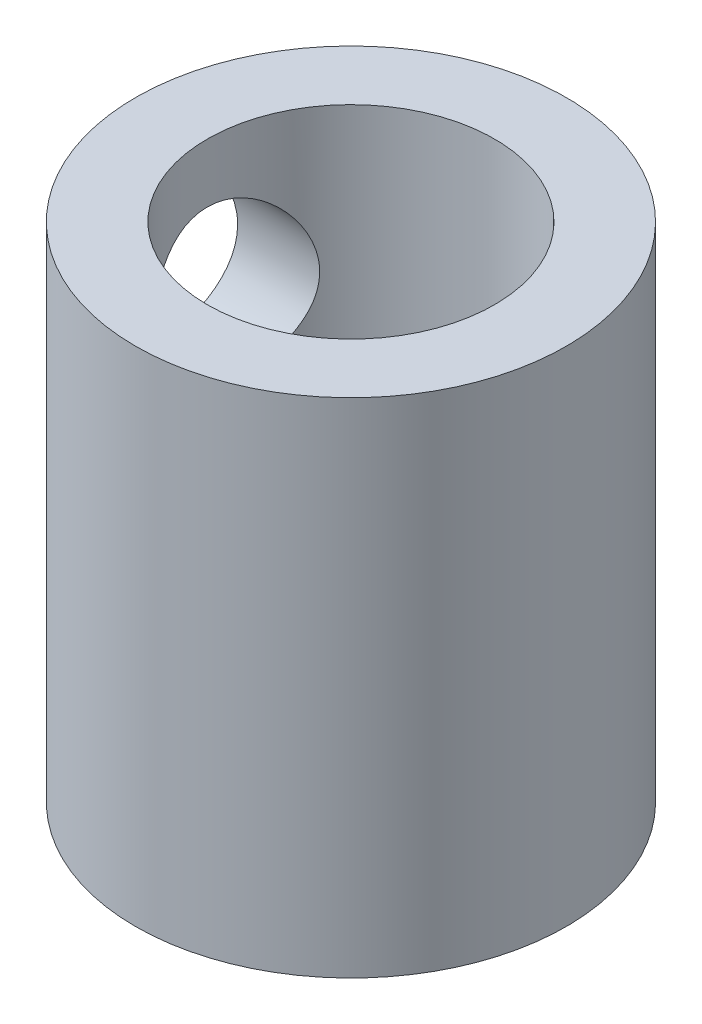
ISO-10303-21;
HEADER;
FILE_DESCRIPTION(('STEP AP214'),'2;1');
FILE_NAME('part.step','',(''),(''),'','','');
FILE_SCHEMA(('AUTOMOTIVE_DESIGN { 1 0 10303 214 1 1 1 1 }'));
ENDSEC;
DATA;
#1=APPLICATION_CONTEXT('core data for automotive mechanical design processes');
#2=APPLICATION_PROTOCOL_DEFINITION('international standard','automotive_design',2000,#1);
#3=PRODUCT_CONTEXT('',#1,'mechanical');
#4=PRODUCT('Part','Part','',(#3));
#5=PRODUCT_RELATED_PRODUCT_CATEGORY('part','',(#4));
#6=PRODUCT_DEFINITION_FORMATION('','',#4);
#7=PRODUCT_DEFINITION_CONTEXT('part definition',#1,'design');
#8=PRODUCT_DEFINITION('design','',#6,#7);
#9=PRODUCT_DEFINITION_SHAPE('','',#8);
#10=(LENGTH_UNIT() NAMED_UNIT(*) SI_UNIT(.MILLI.,.METRE.));
#11=(NAMED_UNIT(*) PLANE_ANGLE_UNIT() SI_UNIT($,.RADIAN.));
#12=(NAMED_UNIT(*) SI_UNIT($,.STERADIAN.) SOLID_ANGLE_UNIT());
#13=UNCERTAINTY_MEASURE_WITH_UNIT(LENGTH_MEASURE(1.E-05),#10,'distance_accuracy_value','');
#14=(GEOMETRIC_REPRESENTATION_CONTEXT(3) GLOBAL_UNCERTAINTY_ASSIGNED_CONTEXT((#13)) GLOBAL_UNIT_ASSIGNED_CONTEXT((#10,
#11,#12)) REPRESENTATION_CONTEXT('',''));
#15=CARTESIAN_POINT('',(0.,0.,0.));
#16=DIRECTION('',(0.,0.,1.));
#17=DIRECTION('',(1.,0.,0.));
#18=AXIS2_PLACEMENT_3D('',#15,#16,#17);
#19=CARTESIAN_POINT('',(0.,35.,0.));
#20=DIRECTION('',(0.,1.,0.));
#21=DIRECTION('',(0.,0.,1.));
#22=AXIS2_PLACEMENT_3D('',#19,#20,#21);
#23=PLANE('',#22);
#24=CARTESIAN_POINT('',(0.,35.,0.));
#25=DIRECTION('',(0.,1.,0.));
#26=DIRECTION('',(0.,0.,1.));
#27=AXIS2_PLACEMENT_3D('',#24,#25,#26);
#28=CIRCLE('',#27,15.);
#29=CARTESIAN_POINT('',(0.,35.,15.));
#30=VERTEX_POINT('',#29);
#31=EDGE_CURVE('E10',#30,#30,#28,.T.);
#32=ORIENTED_EDGE('',*,*,#31,.T.);
#33=EDGE_LOOP('',(#32));
#34=FACE_BOUND('',#33,.T.);
#35=CARTESIAN_POINT('',(0.,35.,0.));
#36=DIRECTION('',(0.,1.,0.));
#37=DIRECTION('',(0.,0.,1.));
#38=AXIS2_PLACEMENT_3D('',#35,#36,#37);
#39=CIRCLE('',#38,10.);
#40=CARTESIAN_POINT('',(0.,35.,10.));
#41=VERTEX_POINT('',#40);
#42=EDGE_CURVE('E47',#41,#41,#39,.T.);
#43=ORIENTED_EDGE('',*,*,#42,.F.);
#44=EDGE_LOOP('',(#43));
#45=FACE_BOUND('',#44,.T.);
#46=ADVANCED_FACE('F36',(#34,#45),#23,.T.);
#47=CARTESIAN_POINT('',(0.,0.,0.));
#48=DIRECTION('',(0.,1.,0.));
#49=DIRECTION('',(0.,0.,1.));
#50=AXIS2_PLACEMENT_3D('',#47,#48,#49);
#51=PLANE('',#50);
#52=CARTESIAN_POINT('',(0.,0.,0.));
#53=DIRECTION('',(0.,1.,0.));
#54=DIRECTION('',(0.,0.,1.));
#55=AXIS2_PLACEMENT_3D('',#52,#53,#54);
#56=CIRCLE('',#55,15.);
#57=CARTESIAN_POINT('',(0.,0.,15.));
#58=VERTEX_POINT('',#57);
#59=EDGE_CURVE('E40',#58,#58,#56,.T.);
#60=ORIENTED_EDGE('',*,*,#59,.F.);
#61=EDGE_LOOP('',(#60));
#62=FACE_BOUND('',#61,.T.);
#63=CARTESIAN_POINT('',(0.,0.,0.));
#64=DIRECTION('',(0.,1.,0.));
#65=DIRECTION('',(0.,0.,1.));
#66=AXIS2_PLACEMENT_3D('',#63,#64,#65);
#67=CIRCLE('',#66,10.);
#68=CARTESIAN_POINT('',(0.,0.,10.));
#69=VERTEX_POINT('',#68);
#70=EDGE_CURVE('E49',#69,#69,#67,.T.);
#71=ORIENTED_EDGE('',*,*,#70,.T.);
#72=EDGE_LOOP('',(#71));
#73=FACE_BOUND('',#72,.T.);
#74=ADVANCED_FACE('F80',(#62,#73),#51,.F.);
#75=CARTESIAN_POINT('',(0.,35.,0.));
#76=DIRECTION('',(0.,-1.,0.));
#77=DIRECTION('',(0.,0.,-1.));
#78=AXIS2_PLACEMENT_3D('',#75,#76,#77);
#79=CYLINDRICAL_SURFACE('',#78,15.);
#80=CARTESIAN_POINT('',(-13.7909390543211,25.,-5.9));
#81=CARTESIAN_POINT('',(-13.7909402060457,24.8416677695512,-5.89999882460423));
#82=CARTESIAN_POINT('',(-13.793674911688,24.6832837447778,-5.89361773947353));
#83=CARTESIAN_POINT('',(-13.8045263852692,24.3676562722599,-5.86815445582322));
#84=CARTESIAN_POINT('',(-13.8126465308322,24.2104136029549,-5.84906428642955));
#85=CARTESIAN_POINT('',(-13.8340196881933,23.897985722144,-5.79833228844356));
#86=CARTESIAN_POINT('',(-13.847283159368,23.7428053739442,-5.76666487980176));
#87=CARTESIAN_POINT('',(-13.8785138115108,23.4358797419054,-5.69109154691234));
#88=CARTESIAN_POINT('',(-13.8964829424716,23.2841359105244,-5.64718054851685));
#89=CARTESIAN_POINT('',(-13.9364772425655,22.9857604625851,-5.5477436320622));
#90=CARTESIAN_POINT('',(-13.9584853264968,22.839110295841,-5.49226651028299));
#91=CARTESIAN_POINT('',(-14.0059541842022,22.5511307982896,-5.37005933870592));
#92=CARTESIAN_POINT('',(-14.0314162529207,22.4098034886033,-5.30332506615788));
#93=CARTESIAN_POINT('',(-14.1118829248642,21.9952465915656,-5.08708678347502));
#94=CARTESIAN_POINT('',(-14.1710218765692,21.7310618888849,-4.92141958544567));
#95=CARTESIAN_POINT('',(-14.2972752200355,21.2202427987624,-4.541990864902));
#96=CARTESIAN_POINT('',(-14.3646407564665,20.9751510994853,-4.32623542048317));
#97=CARTESIAN_POINT('',(-14.4643640553756,20.6365757247692,-3.97455718977551));
#98=CARTESIAN_POINT('',(-14.4974061443945,20.5284979352475,-3.85256523182655));
#99=CARTESIAN_POINT('',(-14.5622093128635,20.3226633119616,-3.59986722311603));
#100=CARTESIAN_POINT('',(-14.5939708318054,20.2249029183086,-3.46916420356061));
#101=CARTESIAN_POINT('',(-14.6565748832548,20.0367996860852,-3.19458877308418));
#102=CARTESIAN_POINT('',(-14.6873351683387,19.9468863865959,-3.05040327150116));
#103=CARTESIAN_POINT('',(-14.7457152964367,19.7796302868374,-2.75438271487159));
#104=CARTESIAN_POINT('',(-14.7733364284273,19.7022823214376,-2.60255083675321));
#105=CARTESIAN_POINT('',(-14.8246626762256,19.5607930266949,-2.29218603309936));
#106=CARTESIAN_POINT('',(-14.8483672980614,19.4966533630049,-2.13365226544653));
#107=CARTESIAN_POINT('',(-14.8911473296102,19.382252703092,-1.81112525987967));
#108=CARTESIAN_POINT('',(-14.9102249774688,19.3319849951415,-1.64713470533712));
#109=CARTESIAN_POINT('',(-14.9424205163612,19.2478378375308,-1.32264932636786));
#110=CARTESIAN_POINT('',(-14.9557746266964,19.2133040701825,-1.16234749894981));
#111=CARTESIAN_POINT('',(-14.9773840643185,19.1576809577832,-0.839154633907996));
#112=CARTESIAN_POINT('',(-14.9856416078205,19.1365857689086,-0.676264753337657));
#113=CARTESIAN_POINT('',(-14.9968294458123,19.1080507540846,-0.349127622464166));
#114=CARTESIAN_POINT('',(-14.9997602950275,19.1006095062045,-0.184880515293256));
#115=CARTESIAN_POINT('',(-15.000211395015,19.0994624684523,0.143666477830177));
#116=CARTESIAN_POINT('',(-14.9977318286247,19.1057562144255,0.307966361811577));
#117=CARTESIAN_POINT('',(-14.9877167280299,19.131288118678,0.626353645028387));
#118=CARTESIAN_POINT('',(-14.9804646591085,19.1498007047089,0.78050881635788));
#119=CARTESIAN_POINT('',(-14.9613738908492,19.1988604987521,1.08665594620403));
#120=CARTESIAN_POINT('',(-14.9495336644254,19.229411713663,1.23864716700865));
#121=CARTESIAN_POINT('',(-14.92157001902,19.3022477237274,1.53933136844004));
#122=CARTESIAN_POINT('',(-14.9054480056963,19.3445286683576,1.68802541416281));
#123=CARTESIAN_POINT('',(-14.8693114808473,19.4404678773342,1.98126573347707));
#124=CARTESIAN_POINT('',(-14.8492954921533,19.4941304599722,2.12581040906238));
#125=CARTESIAN_POINT('',(-14.8055390684327,19.6132475644344,2.41189730808901));
#126=CARTESIAN_POINT('',(-14.7817486820059,19.6788622924178,2.55336524964754));
#127=CARTESIAN_POINT('',(-14.7312372083792,19.8208359901573,2.83028257142587));
#128=CARTESIAN_POINT('',(-14.7045150481743,19.8971988965699,2.96572972243012));
#129=CARTESIAN_POINT('',(-14.6208963117517,20.141591475507,3.3618489480272));
#130=CARTESIAN_POINT('',(-14.5605171733504,20.3250045194958,3.61248856698433));
#131=CARTESIAN_POINT('',(-14.4321202316206,20.7411745186894,4.096417392542));
#132=CARTESIAN_POINT('',(-14.3638608470939,20.9763313478563,4.32758265168975));
#133=CARTESIAN_POINT('',(-14.2638268658667,21.3555983204059,4.64278596442838));
#134=CARTESIAN_POINT('',(-14.2308533158471,21.4865397156949,4.74265289673621));
#135=CARTESIAN_POINT('',(-14.166601924749,21.7565775598494,4.93125716442056));
#136=CARTESIAN_POINT('',(-14.1353234616362,21.8956709776852,5.01999859836045));
#137=CARTESIAN_POINT('',(-14.0745577679135,22.185088099177,5.18796923228143));
#138=CARTESIAN_POINT('',(-14.0451418575362,22.335613786702,5.26687627263677));
#139=CARTESIAN_POINT('',(-13.990016792935,22.643418122994,5.41160112095822));
#140=CARTESIAN_POINT('',(-13.9643061409956,22.8006940096872,5.47742422173314));
#141=CARTESIAN_POINT('',(-13.9174666449394,23.1209173756328,5.59536884554208));
#142=CARTESIAN_POINT('',(-13.8963364427763,23.2838631571586,5.64749443069391));
#143=CARTESIAN_POINT('',(-13.859416351619,23.614232076092,5.73750389249701));
#144=CARTESIAN_POINT('',(-13.8436260501715,23.7816548666177,5.77538886911645));
#145=CARTESIAN_POINT('',(-13.8187483297442,24.1095406424064,5.83465194724241));
#146=CARTESIAN_POINT('',(-13.8093178242862,24.2698245696173,5.85687849988892));
#147=CARTESIAN_POINT('',(-13.7960378800795,24.5919032538798,5.88809218771434));
#148=CARTESIAN_POINT('',(-13.7921881266633,24.7536979252313,5.89708006934837));
#149=CARTESIAN_POINT('',(-13.7902066808758,25.0774728126262,5.90171210108997));
#150=CARTESIAN_POINT('',(-13.792073596073,25.2394529738819,5.89735950059082));
#151=CARTESIAN_POINT('',(-13.8014559524946,25.5623406047948,5.87536860538641));
#152=CARTESIAN_POINT('',(-13.8089712607941,25.7232480996054,5.85773062332881));
#153=CARTESIAN_POINT('',(-13.8288265234595,26.0340056684465,5.81069413788468));
#154=CARTESIAN_POINT('',(-13.8408807634927,26.1839799200733,5.78199006015488));
#155=CARTESIAN_POINT('',(-13.8694347537646,26.4809002019221,5.71315734811135));
#156=CARTESIAN_POINT('',(-13.8859359466588,26.6278452327381,5.67302500606398));
#157=CARTESIAN_POINT('',(-13.9228929408016,26.9177102924539,5.58170893211859));
#158=CARTESIAN_POINT('',(-13.9433479572906,27.0606311136449,5.53052739304295));
#159=CARTESIAN_POINT('',(-13.9876489518739,27.3417078492126,5.4175049260992));
#160=CARTESIAN_POINT('',(-14.0114962290416,27.4798619128476,5.35565991269714));
#161=CARTESIAN_POINT('',(-14.0629349422918,27.7559487427292,5.21913664233492));
#162=CARTESIAN_POINT('',(-14.0906368774712,27.8936583321938,5.1440487664469));
#163=CARTESIAN_POINT('',(-14.1482638454478,28.1623728799531,4.98336383311972));
#164=CARTESIAN_POINT('',(-14.1781896387886,28.2933755184087,4.89776317379113));
#165=CARTESIAN_POINT('',(-14.2394822244992,28.5479747964636,4.71659722458546));
#166=CARTESIAN_POINT('',(-14.2708492662759,28.6715701456456,4.62103020637775));
#167=CARTESIAN_POINT('',(-14.3342355244004,28.9107036479394,4.42049201719032));
#168=CARTESIAN_POINT('',(-14.366254765087,29.026241499646,4.31552049475326));
#169=CARTESIAN_POINT('',(-14.4324465455836,29.2565874293129,4.08893475975462));
#170=CARTESIAN_POINT('',(-14.4666099613662,29.3707569835225,3.96666765077561));
#171=CARTESIAN_POINT('',(-14.5338473230906,29.5884016101233,3.71275142206474));
#172=CARTESIAN_POINT('',(-14.5669216134698,29.6918800861449,3.58110531093949));
#173=CARTESIAN_POINT('',(-14.631108475517,29.8875228744541,3.30910796030632));
#174=CARTESIAN_POINT('',(-14.6622201573071,29.9796820720823,3.168752828394));
#175=CARTESIAN_POINT('',(-14.7215994871583,30.1518951445845,2.88030851278028));
#176=CARTESIAN_POINT('',(-14.7498683539277,30.2319542142229,2.73222268492865));
#177=CARTESIAN_POINT('',(-14.8027698154688,30.3792861831508,2.42932526569162));
#178=CARTESIAN_POINT('',(-14.8274050036342,30.4465682115023,2.27451857419619));
#179=CARTESIAN_POINT('',(-14.8723505409357,30.5677624265992,1.95921743571356));
#180=CARTESIAN_POINT('',(-14.8926626940037,30.6216801915858,1.79872539386968));
#181=CARTESIAN_POINT('',(-14.9283759940124,30.7156187985633,1.47322381343806));
#182=CARTESIAN_POINT('',(-14.94377821171,30.7556426706993,1.30821526834274));
#183=CARTESIAN_POINT('',(-14.9692137787677,30.8213642750504,0.974964570986506));
#184=CARTESIAN_POINT('',(-14.9792474760729,30.847062935717,0.806722629021125));
#185=CARTESIAN_POINT('',(-14.993184077479,30.8826708573968,0.479147147662848));
#186=CARTESIAN_POINT('',(-14.9974354888346,30.8934782456298,0.319925447702606));
#187=CARTESIAN_POINT('',(-15.0008470840685,30.9021547311817,0.00107716373953776));
#188=CARTESIAN_POINT('',(-15.0000074438673,30.9000242755657,-0.158549406082551));
#189=CARTESIAN_POINT('',(-14.9932602985816,30.8828493072718,-0.476974103433217));
#190=CARTESIAN_POINT('',(-14.9873534893032,30.8678065676639,-0.635772341693495));
#191=CARTESIAN_POINT('',(-14.9706331311234,30.8249673696718,-0.951375304358352));
#192=CARTESIAN_POINT('',(-14.9598195961489,30.797170947487,-1.10818003441991));
#193=CARTESIAN_POINT('',(-14.9339590679742,30.7301012283629,-1.41412397879294));
#194=CARTESIAN_POINT('',(-14.9190448660417,30.6911866332738,-1.56335334219988));
#195=CARTESIAN_POINT('',(-14.885228616349,30.6019403833057,-1.85794497720026));
#196=CARTESIAN_POINT('',(-14.8663252530708,30.5516049617329,-2.00330595525283));
#197=CARTESIAN_POINT('',(-14.824994780153,30.4399593177123,-2.28918920407687));
#198=CARTESIAN_POINT('',(-14.8025684517182,30.3786515279293,-2.42971253917626));
#199=CARTESIAN_POINT('',(-14.7547086971211,30.2455017302145,-2.70520396962296));
#200=CARTESIAN_POINT('',(-14.7292741286411,30.1736557181049,-2.84016992827368));
#201=CARTESIAN_POINT('',(-14.674835038114,30.0166163891562,-3.10948536115006));
#202=CARTESIAN_POINT('',(-14.6457235754659,29.9309795838935,-3.24355465719326));
#203=CARTESIAN_POINT('',(-14.5855798338033,29.7493664328509,-3.50410427021545));
#204=CARTESIAN_POINT('',(-14.5545468925697,29.6533865138826,-3.63058194090439));
#205=CARTESIAN_POINT('',(-14.4913216617973,29.4516933911173,-3.87525045297257));
#206=CARTESIAN_POINT('',(-14.4591291626141,29.3459784218224,-3.99343978434872));
#207=CARTESIAN_POINT('',(-14.3943785375693,29.1254386145124,-4.22088267076651));
#208=CARTESIAN_POINT('',(-14.361820401339,29.0106135175922,-4.33013597167141));
#209=CARTESIAN_POINT('',(-14.2952160112987,28.7653611730028,-4.54535313039161));
#210=CARTESIAN_POINT('',(-14.2611969481664,28.6344117308789,-4.65073127997578));
#211=CARTESIAN_POINT('',(-14.1946456314517,28.3638006779449,-4.8500593757657));
#212=CARTESIAN_POINT('',(-14.162112875885,28.2241420468257,-4.94401319849602));
#213=CARTESIAN_POINT('',(-14.0994754334786,27.9368135386432,-5.11991378273269));
#214=CARTESIAN_POINT('',(-14.0693722268589,27.7891388680218,-5.20185324886526));
#215=CARTESIAN_POINT('',(-14.0125787749727,27.4868418067856,-5.35295740460851));
#216=CARTESIAN_POINT('',(-13.9858868770809,27.3322228298144,-5.42212828729465));
#217=CARTESIAN_POINT('',(-13.9389405363009,27.0308232705425,-5.54163240036471));
#218=CARTESIAN_POINT('',(-13.9183270917855,26.8845415469814,-5.59308465660532));
#219=CARTESIAN_POINT('',(-13.8812809006676,26.5879510078154,-5.68440599809569));
#220=CARTESIAN_POINT('',(-13.8648462617418,26.4376440491973,-5.72428032743982));
#221=CARTESIAN_POINT('',(-13.8366839684858,26.1342768672972,-5.79202215661295));
#222=CARTESIAN_POINT('',(-13.8249457751516,25.9812236231072,-5.81991655033091));
#223=CARTESIAN_POINT('',(-13.8065031677492,25.67315562812,-5.86353453725175));
#224=CARTESIAN_POINT('',(-13.7997957561791,25.518142101405,-5.87926537806429));
#225=CARTESIAN_POINT('',(-13.7941208240417,25.3023608110695,-5.89255809078399));
#226=CARTESIAN_POINT('',(-13.792928509975,25.2419329711379,-5.89534794377242));
#227=CARTESIAN_POINT('',(-13.7913373797277,25.1210059450072,-5.89906918227411));
#228=CARTESIAN_POINT('',(-13.7909386141889,25.0605067545011,-5.90000044917818));
#229=CARTESIAN_POINT('',(-13.7909390543211,25.,-5.9));
#230=B_SPLINE_CURVE_WITH_KNOTS('',3,(#80,#81,#82,#83,#84,#85,#86,#87,#88,#89,#90,#91,#92,#93,
#94,#95,#96,#97,#98,#99,#100,#101,#102,#103,#104,#105,#106,#107,#108,#109,#110,#111,#112,#113,
#114,#115,#116,#117,#118,#119,#120,#121,#122,#123,#124,#125,#126,#127,#128,#129,#130,#131,#132,
#133,#134,#135,#136,#137,#138,#139,#140,#141,#142,#143,#144,#145,#146,#147,#148,#149,#150,#151,
#152,#153,#154,#155,#156,#157,#158,#159,#160,#161,#162,#163,#164,#165,#166,#167,#168,#169,#170,
#171,#172,#173,#174,#175,#176,#177,#178,#179,#180,#181,#182,#183,#184,#185,#186,#187,#188,#189,
#190,#191,#192,#193,#194,#195,#196,#197,#198,#199,#200,#201,#202,#203,#204,#205,#206,#207,#208,
#209,#210,#211,#212,#213,#214,#215,#216,#217,#218,#219,#220,#221,#222,#223,#224,#225,#226,#227,
#228,#229),.UNSPECIFIED.,.T.,.F.,(4,2,2,2,2,2,2,2,2,2,2,2,2,2,2,2,2,2,2,2,2,2,2,2,2,2,2,2,2,2,2,
2,2,2,2,2,2,2,2,2,2,2,2,2,2,2,2,2,2,2,2,2,2,2,2,2,2,2,2,2,2,2,2,2,2,2,2,2,2,2,2,2,2,2,4),(0.,
0.47493524854681,0.950168647601479,1.42637358433426,1.90277617020643,2.37720812394837,
2.85181844262376,3.79983942760981,4.79536296386054,5.29379710762872,5.79205870675647,
6.3094719542892,6.82667197178006,7.3439371716772,7.86095166038914,8.35388280671364,
8.84659945322353,9.33926478496598,9.83191346803334,10.2976619185308,10.7635655183611,
11.2293163564277,11.6952442214998,12.1679510613356,12.6408314887652,13.5859755473552,
14.5913580392238,15.0947275624705,15.5979110992303,16.1147029862334,16.6312853895197,
17.1477144224524,17.6641035573513,18.1497497037587,18.6353684662289,19.1208689540428,
19.6063580168288,20.0653493252951,20.5244897167862,20.9835390709574,21.4427646947067,
21.9200835113019,22.3975663254953,22.8751320811942,23.3527156915354,23.8643269187382,
24.3757747633218,24.8874528639675,25.3989106657972,25.910001650049,26.4208789444052,
26.9316447504799,27.442377448746,27.9207143438747,28.3990347102422,28.8772894058208,
29.3555427439532,29.8198355836566,30.2842817745771,30.7486251212111,31.2131453623012,
31.6977958617755,32.1826143312681,32.6675208987085,33.152441251884,33.6663095653446,
34.1800030225328,34.6940071249249,35.2077612639109,35.6765374206529,36.1451009180001,
36.6126069627553,37.0798342305815,37.2613194322301,37.4428162153314),.UNSPECIFIED.);
#231=CARTESIAN_POINT('',(-13.7909390543211,25.,-5.9));
#232=VERTEX_POINT('',#231);
#233=EDGE_CURVE('E52',#232,#232,#230,.T.);
#234=ORIENTED_EDGE('',*,*,#233,.F.);
#235=EDGE_LOOP('',(#234));
#236=FACE_BOUND('',#235,.T.);
#237=ORIENTED_EDGE('',*,*,#31,.F.);
#238=EDGE_LOOP('',(#237));
#239=FACE_BOUND('',#238,.T.);
#240=ORIENTED_EDGE('',*,*,#59,.T.);
#241=EDGE_LOOP('',(#240));
#242=FACE_BOUND('',#241,.T.);
#243=ADVANCED_FACE('F38',(#236,#239,#242),#79,.T.);
#244=CARTESIAN_POINT('',(0.,35.,0.));
#245=DIRECTION('',(0.,-1.,0.));
#246=DIRECTION('',(0.,0.,-1.));
#247=AXIS2_PLACEMENT_3D('',#244,#245,#246);
#248=CYLINDRICAL_SURFACE('',#247,10.);
#249=CARTESIAN_POINT('',(-8.07403244977378,25.,-5.9));
#250=CARTESIAN_POINT('',(-8.07403194677616,24.8509654853228,-5.90000035178207));
#251=CARTESIAN_POINT('',(-8.07817403121499,24.7019351163553,-5.8943447262095));
#252=CARTESIAN_POINT('',(-8.09455740863576,24.4051806712456,-5.87182532964383));
#253=CARTESIAN_POINT('',(-8.10679855091517,24.2574565708488,-5.85496176720145));
#254=CARTESIAN_POINT('',(-8.13886944092752,23.9644184273271,-5.81029740235263));
#255=CARTESIAN_POINT('',(-8.15870427865381,23.8191060690849,-5.78248926353304));
#256=CARTESIAN_POINT('',(-8.20518503808227,23.5319557339646,-5.71634226138283));
#257=CARTESIAN_POINT('',(-8.2318341558173,23.3901194217224,-5.67799845598413));
#258=CARTESIAN_POINT('',(-8.29076140498204,23.1118575635961,-5.59159941463497));
#259=CARTESIAN_POINT('',(-8.32299604030639,22.9753995355548,-5.54361879499641));
#260=CARTESIAN_POINT('',(-8.39221744411217,22.7073835556749,-5.43825892115386));
#261=CARTESIAN_POINT('',(-8.42920599002252,22.5758274604612,-5.38087614938349));
#262=CARTESIAN_POINT('',(-8.5457253479698,22.1893507978678,-5.19537171052358));
#263=CARTESIAN_POINT('',(-8.63085019135202,21.9424425907884,-5.05383747056035));
#264=CARTESIAN_POINT('',(-8.81847524463988,21.4454741312968,-4.71967122744551));
#265=CARTESIAN_POINT('',(-8.92184105013463,21.198468026556,-4.52298422915708));
#266=CARTESIAN_POINT('',(-9.07588627068802,20.8536478215014,-4.20030809438153));
#267=CARTESIAN_POINT('',(-9.12710197832592,20.7429225863106,-4.08805586024308));
#268=CARTESIAN_POINT('',(-9.22810361326059,20.5304759953828,-3.85464063927642));
#269=CARTESIAN_POINT('',(-9.27788928096714,20.4287562674933,-3.73347604865621));
#270=CARTESIAN_POINT('',(-9.37993460449194,20.2248825331322,-3.46970397963144));
#271=CARTESIAN_POINT('',(-9.43191551009926,20.1237771521254,-3.32617580413092));
#272=CARTESIAN_POINT('',(-9.5313145031746,19.9341862085707,-3.0296016836546));
#273=CARTESIAN_POINT('',(-9.5787346168618,19.845695033417,-2.8765600154476));
#274=CARTESIAN_POINT('',(-9.66766355185064,19.6822544282578,-2.56183658147779));
#275=CARTESIAN_POINT('',(-9.70917478457414,19.6072994707296,-2.40015837755739));
#276=CARTESIAN_POINT('',(-9.78504323589538,19.4718701474442,-2.06923350231136));
#277=CARTESIAN_POINT('',(-9.81940158252389,19.4113934981903,-1.8999880294876));
#278=CARTESIAN_POINT('',(-9.87704629099734,19.3107487404816,-1.57135235988986));
#279=CARTESIAN_POINT('',(-9.90106492915783,19.2692154897541,-1.41250825914307));
#280=CARTESIAN_POINT('',(-9.94162907007419,19.1994140302522,-1.09098826653199));
#281=CARTESIAN_POINT('',(-9.9581749953399,19.1711450715066,-0.928312591853597));
#282=CARTESIAN_POINT('',(-9.98329412724801,19.1283339683521,-0.6006770375845));
#283=CARTESIAN_POINT('',(-9.9918733171785,19.1137815222541,-0.43571896680617));
#284=CARTESIAN_POINT('',(-10.0008173539975,19.0986114146928,-0.104947037803334));
#285=CARTESIAN_POINT('',(-10.0011829961305,19.0979924041793,0.0608667360161782));
#286=CARTESIAN_POINT('',(-9.99414560784731,19.1099268711703,0.371830022539261));
#287=CARTESIAN_POINT('',(-9.98767238603499,19.1209037599247,0.517064448969222));
#288=CARTESIAN_POINT('',(-9.96851912397127,19.1535011769384,0.805970099228875));
#289=CARTESIAN_POINT('',(-9.95583705190722,19.1751251894247,0.94964079559286));
#290=CARTESIAN_POINT('',(-9.92456324568373,19.2287411449698,1.23431982968133));
#291=CARTESIAN_POINT('',(-9.9059735877944,19.2607294454907,1.37532908437347));
#292=CARTESIAN_POINT('',(-9.86329072828686,19.3347183231278,1.65389332534485));
#293=CARTESIAN_POINT('',(-9.83919540492308,19.3767227604851,1.79144695717094));
#294=CARTESIAN_POINT('',(-9.78584264544521,19.470604081932,2.06314540148256));
#295=CARTESIAN_POINT('',(-9.75655269538225,19.5225433203911,2.19726226831683));
#296=CARTESIAN_POINT('',(-9.6935192757679,19.6356256683325,2.46049473901651));
#297=CARTESIAN_POINT('',(-9.65977421973162,19.6967720576212,2.58960853997988));
#298=CARTESIAN_POINT('',(-9.55283746548871,19.8932554564068,2.96850238609874));
#299=CARTESIAN_POINT('',(-9.47390728016816,20.0416999863439,3.21001594774988));
#300=CARTESIAN_POINT('',(-9.29671033819533,20.3887457385319,3.69395090415295));
#301=CARTESIAN_POINT('',(-9.19726143832619,20.5911876011683,3.93315663524854));
#302=CARTESIAN_POINT('',(-8.99482792623645,21.0307389026205,4.37634903458124));
#303=CARTESIAN_POINT('',(-8.89183883127264,21.2678936339785,4.58028891861463));
#304=CARTESIAN_POINT('',(-8.73644914867905,21.6605273345861,4.86704104625418));
#305=CARTESIAN_POINT('',(-8.68190866873821,21.8054601165673,4.96340284088538));
#306=CARTESIAN_POINT('',(-8.57644419670124,22.1043228408067,5.14348868759047));
#307=CARTESIAN_POINT('',(-8.5255207665863,22.2582541744267,5.22721077809744));
#308=CARTESIAN_POINT('',(-8.42925028426885,22.5741292141263,5.381075540283));
#309=CARTESIAN_POINT('',(-8.38389496564624,22.736060529627,5.45123843309376));
#310=CARTESIAN_POINT('',(-8.30060158045355,23.0672234897772,5.57725081071061));
#311=CARTESIAN_POINT('',(-8.26266071107048,23.2364523461624,5.63310570672271));
#312=CARTESIAN_POINT('',(-8.2040818304837,23.5393790956185,5.71795558879529));
#313=CARTESIAN_POINT('',(-8.18147770047351,23.6718004684859,5.75017968787299));
#314=CARTESIAN_POINT('',(-8.14231868741327,23.9394072614419,5.80549733664098));
#315=CARTESIAN_POINT('',(-8.12576252102306,24.0745920887064,5.82859282345124));
#316=CARTESIAN_POINT('',(-8.09928345468902,24.3467638939137,5.86533222685686));
#317=CARTESIAN_POINT('',(-8.08935459248145,24.4837491386448,5.87898463932967));
#318=CARTESIAN_POINT('',(-8.07647118175163,24.7586738318744,5.8966714801547));
#319=CARTESIAN_POINT('',(-8.07351679313091,24.8966133021773,5.90070568799342));
#320=CARTESIAN_POINT('',(-8.07469622911354,25.1725519517677,5.89909160637388));
#321=CARTESIAN_POINT('',(-8.07883759540569,25.3105510385407,5.89343301497251));
#322=CARTESIAN_POINT('',(-8.09406486266261,25.5854254750336,5.87250197070435));
#323=CARTESIAN_POINT('',(-8.10515079667815,25.7223008194023,5.85722947208279));
#324=CARTESIAN_POINT('',(-8.13387077419453,25.9940387682396,5.817280300039));
#325=CARTESIAN_POINT('',(-8.1515078490991,26.1289004108116,5.79259927287734));
#326=CARTESIAN_POINT('',(-8.19272031460896,26.3957370463124,5.73416114507816));
#327=CARTESIAN_POINT('',(-8.21629811867438,26.5277108422945,5.70040035535103));
#328=CARTESIAN_POINT('',(-8.29504224729507,26.9191239469439,5.58577915185982));
#329=CARTESIAN_POINT('',(-8.35812601575579,27.1732398552239,5.49170236475429));
#330=CARTESIAN_POINT('',(-8.49854679503987,27.6628141630216,5.27178135161822));
#331=CARTESIAN_POINT('',(-8.57588933166809,27.8982652784752,5.14592480272989));
#332=CARTESIAN_POINT('',(-8.7525451806834,28.3879100123294,4.84037246424578));
#333=CARTESIAN_POINT('',(-8.85333163347698,28.6381340665333,4.65510325643347));
#334=CARTESIAN_POINT('',(-9.00510117266995,28.9891051747411,4.34984574837167));
#335=CARTESIAN_POINT('',(-9.05582862970115,29.1021123463606,4.24344177160444));
#336=CARTESIAN_POINT('',(-9.15641396013375,29.319632137531,4.02179989712783));
#337=CARTESIAN_POINT('',(-9.20627168138743,29.4241432823,3.90656047243564));
#338=CARTESIAN_POINT('',(-9.30985417062652,29.6360457656227,3.65342108720689));
#339=CARTESIAN_POINT('',(-9.36333015019836,29.7422918083467,3.51445818680798));
#340=CARTESIAN_POINT('',(-9.46634637447387,29.9425787651814,3.22670506477687));
#341=CARTESIAN_POINT('',(-9.5158882444542,30.0366247297236,3.07791894837101));
#342=CARTESIAN_POINT('',(-9.60966376567544,30.2116307168331,2.77129128152329));
#343=CARTESIAN_POINT('',(-9.65389888702233,30.2925943657045,2.61345225696246));
#344=CARTESIAN_POINT('',(-9.73576777039091,30.4404934045984,2.28969233792884));
#345=CARTESIAN_POINT('',(-9.77340244362461,30.5074307312464,2.12377256307553));
#346=CARTESIAN_POINT('',(-9.83831565012051,30.6217876127554,1.79804926748066));
#347=CARTESIAN_POINT('',(-9.86616547627118,30.6703071224942,1.63874591327957));
#348=CARTESIAN_POINT('',(-9.91443660103751,30.7538873147787,1.31553597240223));
#349=CARTESIAN_POINT('',(-9.93485820701348,30.7889485541957,1.15162957649017));
#350=CARTESIAN_POINT('',(-9.96764416775322,30.8450361770651,0.820779943355493));
#351=CARTESIAN_POINT('',(-9.9800154962809,30.8660747084409,0.65383946372077));
#352=CARTESIAN_POINT('',(-9.99634081538199,30.8938067318583,0.318368596496184));
#353=CARTESIAN_POINT('',(-10.0002957989716,30.9005019162238,0.149838398828821));
#354=CARTESIAN_POINT('',(-9.99970944872383,30.8995070498941,-0.165603305233768));
#355=CARTESIAN_POINT('',(-9.99618908943603,30.8935456428409,-0.312525845001256));
#356=CARTESIAN_POINT('',(-9.98274080545253,30.8707069787948,-0.605276015032725));
#357=CARTESIAN_POINT('',(-9.97281078802457,30.8538261566449,-0.751103271953601));
#358=CARTESIAN_POINT('',(-9.94678198715074,30.8093713605969,-1.04049480723545));
#359=CARTESIAN_POINT('',(-9.93068560173498,30.7818015434765,-1.18405994274165));
#360=CARTESIAN_POINT('',(-9.89268941918714,30.7162938300778,-1.46807180104372));
#361=CARTESIAN_POINT('',(-9.87078738020516,30.6783519284472,-1.60851729643785));
#362=CARTESIAN_POINT('',(-9.82190747259529,30.592949268094,-1.88401351335117));
#363=CARTESIAN_POINT('',(-9.79498177971611,30.5455860516891,-2.0191037726953));
#364=CARTESIAN_POINT('',(-9.73647431143735,30.4415781427079,-2.28464145468201));
#365=CARTESIAN_POINT('',(-9.70489089308179,30.3849301742597,-2.41508721879651));
#366=CARTESIAN_POINT('',(-9.60407841933995,30.2018046831087,-2.79845036314415));
#367=CARTESIAN_POINT('',(-9.5287514398029,30.0620847684976,-3.04358733222613));
#368=CARTESIAN_POINT('',(-9.35853850970282,29.7343400646334,-3.53448499080682));
#369=CARTESIAN_POINT('',(-9.26241408995566,29.542701450549,-3.77737556977172));
#370=CARTESIAN_POINT('',(-9.06483891345434,29.1249512110339,-4.22960871513877));
#371=CARTESIAN_POINT('',(-8.96338208755494,28.8987997218189,-4.43891190572136));
#372=CARTESIAN_POINT('',(-8.80802142161079,28.52226571511,-4.73638477664653));
#373=CARTESIAN_POINT('',(-8.75283178995287,28.3823144299152,-4.83733893193114));
#374=CARTESIAN_POINT('',(-8.64524661350822,28.0932652454816,-5.02708542332739));
#375=CARTESIAN_POINT('',(-8.59285177424316,27.9441650569154,-5.11587469730773));
#376=CARTESIAN_POINT('',(-8.49269639429252,27.637587018479,-5.28047291961628));
#377=CARTESIAN_POINT('',(-8.44493332219367,27.4801138184365,-5.35628897575681));
#378=CARTESIAN_POINT('',(-8.35590546687342,27.1575778546487,-5.49414032377748));
#379=CARTESIAN_POINT('',(-8.31463607956547,26.9925205763477,-5.5561853923552));
#380=CARTESIAN_POINT('',(-8.24555321181127,26.6790434538414,-5.65810072143412));
#381=CARTESIAN_POINT('',(-8.21666883925253,26.5314697523694,-5.69984930206089));
#382=CARTESIAN_POINT('',(-8.16621779730827,26.2323997376759,-5.77189971287028));
#383=CARTESIAN_POINT('',(-8.14464673902386,26.0809058360317,-5.80220840964906));
#384=CARTESIAN_POINT('',(-8.10974670384158,25.7752477797079,-5.85088962451312));
#385=CARTESIAN_POINT('',(-8.09640805988249,25.6210869763125,-5.86927614372026));
#386=CARTESIAN_POINT('',(-8.0785513831078,25.3112825659408,-5.89383088789374));
#387=CARTESIAN_POINT('',(-8.07403297506189,25.1556390223265,-5.8999996326286));
#388=CARTESIAN_POINT('',(-8.07403244977378,25.,-5.9));
#389=B_SPLINE_CURVE_WITH_KNOTS('',3,(#249,#250,#251,#252,#253,#254,#255,#256,#257,#258,#259,
#260,#261,#262,#263,#264,#265,#266,#267,#268,#269,#270,#271,#272,#273,#274,#275,#276,#277,#278,
#279,#280,#281,#282,#283,#284,#285,#286,#287,#288,#289,#290,#291,#292,#293,#294,#295,#296,#297,
#298,#299,#300,#301,#302,#303,#304,#305,#306,#307,#308,#309,#310,#311,#312,#313,#314,#315,#316,
#317,#318,#319,#320,#321,#322,#323,#324,#325,#326,#327,#328,#329,#330,#331,#332,#333,#334,#335,
#336,#337,#338,#339,#340,#341,#342,#343,#344,#345,#346,#347,#348,#349,#350,#351,#352,#353,#354,
#355,#356,#357,#358,#359,#360,#361,#362,#363,#364,#365,#366,#367,#368,#369,#370,#371,#372,#373,
#374,#375,#376,#377,#378,#379,#380,#381,#382,#383,#384,#385,#386,#387,#388),.UNSPECIFIED.,.T.,
.F.,(4,2,2,2,2,2,2,2,2,2,2,2,2,2,2,2,2,2,2,2,2,2,2,2,2,2,2,2,2,2,2,2,2,2,2,2,2,2,2,2,2,2,2,2,2,
2,2,2,2,2,2,2,2,2,2,2,2,2,2,2,2,2,2,2,2,2,2,2,2,4),(0.,0.446934019753089,0.893859723453197,
1.34108552386237,1.78852146804758,2.23261801091226,2.67688108171362,3.56483665069324,
4.55737971391525,5.05432881686741,5.55136756637617,6.09994436839766,6.64827631785449,
7.1963838468092,7.74440487203844,8.24148953940733,8.73854609791134,9.23522904746692,
9.73186390744167,10.1687193947842,10.6057179363755,11.0425630607446,11.4795768190688,
11.9194292060132,12.3594386511626,13.2388776356783,14.2214605733008,15.2053371833975,
15.7519265612342,16.2986006777582,16.8444531268978,17.3900988318303,17.8041195638479,
18.2180523921474,18.6316123214434,19.0451817322043,19.4591909759293,19.8732021900333,
20.2874052183296,20.7017767914036,21.5329805753901,22.3645071615922,23.3420566792919,
23.8315861401714,24.3212003953234,24.8692577895468,25.4170875770589,25.9647652494438,
26.5123672536378,27.018161478421,27.5239347723819,28.0292693416236,28.5345442848346,
28.9752625527712,29.4161247866031,29.8568157479007,30.2976771302978,30.7341917186451,
31.17086065213,32.0435865353079,33.0118619932584,33.98126443419,34.5242348168742,
35.0673416253733,35.6101499151774,36.1525715973314,36.6201623924245,37.0874720760559,
37.5542319635635,38.0209719937469),.UNSPECIFIED.);
#390=CARTESIAN_POINT('',(-8.07403244977378,25.,-5.9));
#391=VERTEX_POINT('',#390);
#392=EDGE_CURVE('E62',#391,#391,#389,.T.);
#393=ORIENTED_EDGE('',*,*,#392,.T.);
#394=EDGE_LOOP('',(#393));
#395=FACE_BOUND('',#394,.T.);
#396=ORIENTED_EDGE('',*,*,#42,.T.);
#397=EDGE_LOOP('',(#396));
#398=FACE_BOUND('',#397,.T.);
#399=ORIENTED_EDGE('',*,*,#70,.F.);
#400=EDGE_LOOP('',(#399));
#401=FACE_BOUND('',#400,.T.);
#402=ADVANCED_FACE('F73',(#395,#398,#401),#248,.F.);
#403=CARTESIAN_POINT('',(-15.001,25.,0.));
#404=DIRECTION('',(1.,0.,0.));
#405=DIRECTION('',(0.,0.,-1.));
#406=AXIS2_PLACEMENT_3D('',#403,#404,#405);
#407=CYLINDRICAL_SURFACE('',#406,5.9);
#408=ORIENTED_EDGE('',*,*,#392,.F.);
#409=EDGE_LOOP('',(#408));
#410=FACE_BOUND('',#409,.T.);
#411=ORIENTED_EDGE('',*,*,#233,.T.);
#412=EDGE_LOOP('',(#411));
#413=FACE_BOUND('',#412,.T.);
#414=ADVANCED_FACE('F67',(#410,#413),#407,.F.);
#415=CLOSED_SHELL('',(#46,#74,#243,#402,#414));
#416=MANIFOLD_SOLID_BREP('B2',#415);
#417=ADVANCED_BREP_SHAPE_REPRESENTATION('',(#18,#416),#14);
#418=SHAPE_DEFINITION_REPRESENTATION(#9,#417);
ENDSEC;
END-ISO-10303-21;
